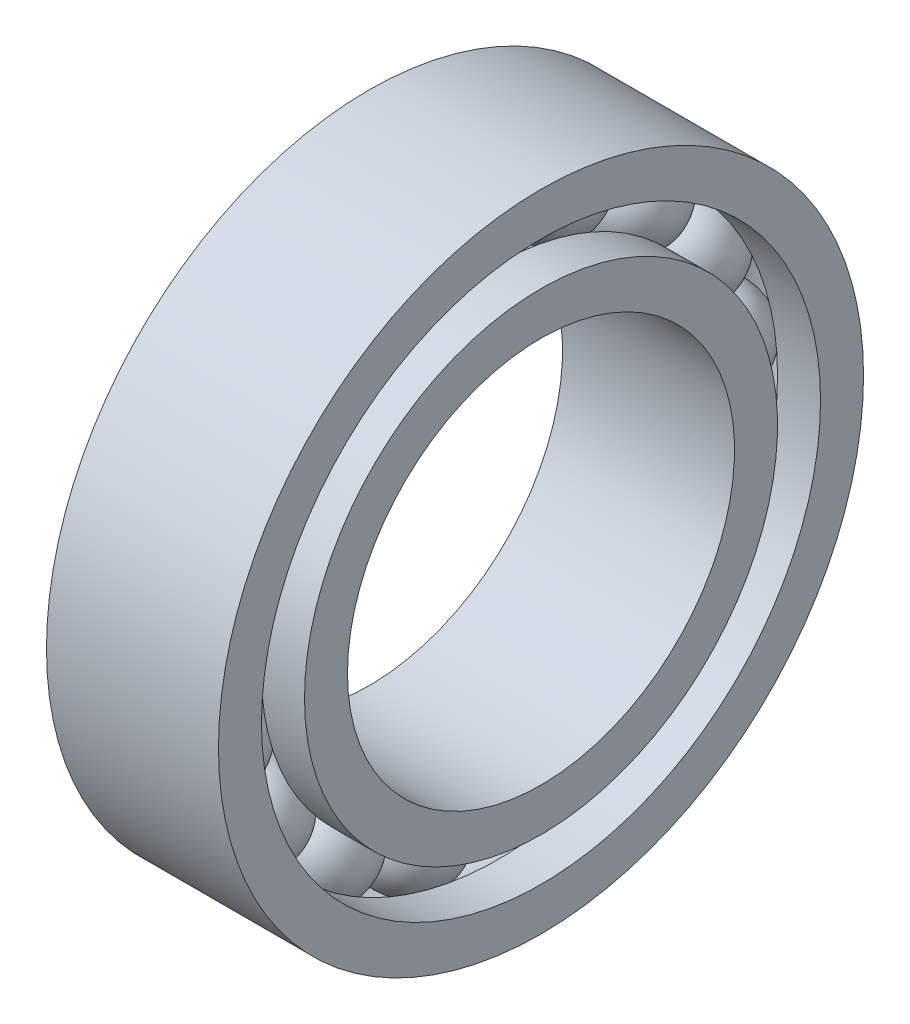
ISO-10303-21;
HEADER;
FILE_DESCRIPTION(('STEP AP214'),'2;1');
FILE_NAME('part.step','',(''),(''),'','','');
FILE_SCHEMA(('AUTOMOTIVE_DESIGN { 1 0 10303 214 1 1 1 1 }'));
ENDSEC;
DATA;
#1=APPLICATION_CONTEXT('core data for automotive mechanical design processes');
#2=APPLICATION_PROTOCOL_DEFINITION('international standard','automotive_design',2000,#1);
#3=PRODUCT_CONTEXT('',#1,'mechanical');
#4=PRODUCT('Part','Part','',(#3));
#5=PRODUCT_RELATED_PRODUCT_CATEGORY('part','',(#4));
#6=PRODUCT_DEFINITION_FORMATION('','',#4);
#7=PRODUCT_DEFINITION_CONTEXT('part definition',#1,'design');
#8=PRODUCT_DEFINITION('design','',#6,#7);
#9=PRODUCT_DEFINITION_SHAPE('','',#8);
#10=(LENGTH_UNIT() NAMED_UNIT(*) SI_UNIT(.MILLI.,.METRE.));
#11=(NAMED_UNIT(*) PLANE_ANGLE_UNIT() SI_UNIT($,.RADIAN.));
#12=(NAMED_UNIT(*) SI_UNIT($,.STERADIAN.) SOLID_ANGLE_UNIT());
#13=UNCERTAINTY_MEASURE_WITH_UNIT(LENGTH_MEASURE(1.E-05),#10,'distance_accuracy_value','');
#14=(GEOMETRIC_REPRESENTATION_CONTEXT(3) GLOBAL_UNCERTAINTY_ASSIGNED_CONTEXT((#13)) GLOBAL_UNIT_ASSIGNED_CONTEXT((#10,
#11,#12)) REPRESENTATION_CONTEXT('',''));
#15=CARTESIAN_POINT('',(0.,0.,0.));
#16=DIRECTION('',(0.,0.,1.));
#17=DIRECTION('',(1.,0.,0.));
#18=AXIS2_PLACEMENT_3D('',#15,#16,#17);
#19=CARTESIAN_POINT('',(0.,10.9483337642616,-21.6744999712284));
#20=DIRECTION('',(-1.,0.,0.));
#21=DIRECTION('',(0.,0.932472229404361,-0.361241666187141));
#22=AXIS2_PLACEMENT_3D('',#19,#20,#21);
#23=SPHERICAL_SURFACE('',#22,11.);
#24=CARTESIAN_POINT('',(-11.,10.9483337642616,-21.6744999712284));
#25=VERTEX_POINT('',#24);
#26=VERTEX_LOOP('',#25);
#27=FACE_BOUND('',#26,.T.);
#28=ADVANCED_FACE('F42',(#27),#23,.T.);
#29=CLOSED_SHELL('',(#28));
#30=MANIFOLD_SOLID_BREP('B2',#29);
#31=CARTESIAN_POINT('',(0.,-0.659464966759945,-40.4217386187929));
#32=DIRECTION('',(-1.,0.,0.));
#33=DIRECTION('',(0.,0.739008917220668,-0.673695643646548));
#34=AXIS2_PLACEMENT_3D('',#31,#32,#33);
#35=SPHERICAL_SURFACE('',#34,11.);
#36=CARTESIAN_POINT('',(-11.,-0.659464966759945,-40.4217386187929));
#37=VERTEX_POINT('',#36);
#38=VERTEX_LOOP('',#37);
#39=FACE_BOUND('',#38,.T.);
#40=ADVANCED_FACE('F63',(#39),#35,.T.);
#41=CLOSED_SHELL('',(#40));
#42=MANIFOLD_SOLID_BREP('B6',#41);
#43=CARTESIAN_POINT('',(0.,-18.2556986534071,-53.7097974813034));
#44=DIRECTION('',(-1.,0.,0.));
#45=DIRECTION('',(0.,0.445738355776549,-0.895163291355057));
#46=AXIS2_PLACEMENT_3D('',#43,#44,#45);
#47=SPHERICAL_SURFACE('',#46,11.);
#48=CARTESIAN_POINT('',(-11.,-18.2556986534071,-53.7097974813034));
#49=VERTEX_POINT('',#48);
#50=VERTEX_LOOP('',#49);
#51=FACE_BOUND('',#50,.T.);
#52=ADVANCED_FACE('F84',(#51),#47,.T.);
#53=CLOSED_SHELL('',(#52));
#54=MANIFOLD_SOLID_BREP('B38',#53);
#55=CARTESIAN_POINT('',(0.,-39.4638984322012,-59.744050577702));
#56=DIRECTION('',(-1.,0.,0.));
#57=DIRECTION('',(0.,0.092268359463313,-0.995734176295033));
#58=AXIS2_PLACEMENT_3D('',#55,#56,#57);
#59=SPHERICAL_SURFACE('',#58,11.);
#60=CARTESIAN_POINT('',(-11.,-39.4638984322012,-59.744050577702));
#61=VERTEX_POINT('',#60);
#62=VERTEX_LOOP('',#61);
#63=FACE_BOUND('',#62,.T.);
#64=ADVANCED_FACE('F105',(#63),#59,.T.);
#65=CLOSED_SHELL('',(#64));
#66=MANIFOLD_SOLID_BREP('B59',#65);
#67=CARTESIAN_POINT('',(0.,-61.4197794043244,-57.7095385903693));
#68=DIRECTION('',(-1.,0.,0.));
#69=DIRECTION('',(0.,-0.273662990072073,-0.961825643172822));
#70=AXIS2_PLACEMENT_3D('',#67,#68,#69);
#71=SPHERICAL_SURFACE('',#70,11.);
#72=CARTESIAN_POINT('',(-11.,-61.4197794043244,-57.7095385903693));
#73=VERTEX_POINT('',#72);
#74=VERTEX_LOOP('',#73);
#75=FACE_BOUND('',#74,.T.);
#76=ADVANCED_FACE('F126',(#75),#71,.T.);
#77=CLOSED_SHELL('',(#76));
#78=MANIFOLD_SOLID_BREP('B80',#77);
#79=CARTESIAN_POINT('',(0.,-81.158078182755,-47.8810336368147));
#80=DIRECTION('',(-1.,0.,0.));
#81=DIRECTION('',(0.,-0.602634636379249,-0.798017227280245));
#82=AXIS2_PLACEMENT_3D('',#79,#80,#81);
#83=SPHERICAL_SURFACE('',#82,11.);
#84=CARTESIAN_POINT('',(-11.,-81.158078182755,-47.8810336368147));
#85=VERTEX_POINT('',#84);
#86=VERTEX_LOOP('',#85);
#87=FACE_BOUND('',#86,.T.);
#88=ADVANCED_FACE('F147',(#87),#83,.T.);
#89=CLOSED_SHELL('',(#88));
#90=MANIFOLD_SOLID_BREP('B101',#89);
#91=CARTESIAN_POINT('',(0.,-96.0130281437766,-31.5859297726418));
#92=DIRECTION('',(-1.,0.,0.));
#93=DIRECTION('',(0.,-0.85021713572961,-0.526432162877363));
#94=AXIS2_PLACEMENT_3D('',#91,#92,#93);
#95=SPHERICAL_SURFACE('',#94,11.);
#96=CARTESIAN_POINT('',(-11.,-96.0130281437766,-31.5859297726418));
#97=VERTEX_POINT('',#96);
#98=VERTEX_LOOP('',#97);
#99=FACE_BOUND('',#98,.T.);
#100=ADVANCED_FACE('F168',(#99),#95,.T.);
#101=CLOSED_SHELL('',(#100));
#102=MANIFOLD_SOLID_BREP('B122',#101);
#103=CARTESIAN_POINT('',(0.,-103.978385981034,-11.0249710689947));
#104=DIRECTION('',(-1.,0.,0.));
#105=DIRECTION('',(0.,-0.9829730996839,-0.183749517816578));
#106=AXIS2_PLACEMENT_3D('',#103,#104,#105);
#107=SPHERICAL_SURFACE('',#106,11.);
#108=CARTESIAN_POINT('',(-11.,-103.978385981034,-11.0249710689947));
#109=VERTEX_POINT('',#108);
#110=VERTEX_LOOP('',#109);
#111=FACE_BOUND('',#110,.T.);
#112=ADVANCED_FACE('F189',(#111),#107,.T.);
#113=CLOSED_SHELL('',(#112));
#114=MANIFOLD_SOLID_BREP('B143',#113);
#115=CARTESIAN_POINT('',(0.,-103.978385981034,11.0249710689938));
#116=DIRECTION('',(-1.,0.,0.));
#117=DIRECTION('',(0.,-0.982973099683903,0.183749517816564));
#118=AXIS2_PLACEMENT_3D('',#115,#116,#117);
#119=SPHERICAL_SURFACE('',#118,11.);
#120=CARTESIAN_POINT('',(-11.,-103.978385981034,11.0249710689938));
#121=VERTEX_POINT('',#120);
#122=VERTEX_LOOP('',#121);
#123=FACE_BOUND('',#122,.T.);
#124=ADVANCED_FACE('F210',(#123),#119,.T.);
#125=CLOSED_SHELL('',(#124));
#126=MANIFOLD_SOLID_BREP('B164',#125);
#127=CARTESIAN_POINT('',(0.,-96.013028143777,31.585929772641));
#128=DIRECTION('',(-1.,0.,0.));
#129=DIRECTION('',(0.,-0.850217135729617,0.526432162877351));
#130=AXIS2_PLACEMENT_3D('',#127,#128,#129);
#131=SPHERICAL_SURFACE('',#130,11.);
#132=CARTESIAN_POINT('',(-11.,-96.013028143777,31.585929772641));
#133=VERTEX_POINT('',#132);
#134=VERTEX_LOOP('',#133);
#135=FACE_BOUND('',#134,.T.);
#136=ADVANCED_FACE('F231',(#135),#131,.T.);
#137=CLOSED_SHELL('',(#136));
#138=MANIFOLD_SOLID_BREP('B185',#137);
#139=CARTESIAN_POINT('',(0.,-81.1580781827556,47.8810336368142));
#140=DIRECTION('',(-1.,0.,0.));
#141=DIRECTION('',(0.,-0.602634636379261,0.798017227280236));
#142=AXIS2_PLACEMENT_3D('',#139,#140,#141);
#143=SPHERICAL_SURFACE('',#142,11.);
#144=CARTESIAN_POINT('',(-11.,-81.1580781827556,47.8810336368142));
#145=VERTEX_POINT('',#144);
#146=VERTEX_LOOP('',#145);
#147=FACE_BOUND('',#146,.T.);
#148=ADVANCED_FACE('F252',(#147),#143,.T.);
#149=CLOSED_SHELL('',(#148));
#150=MANIFOLD_SOLID_BREP('B206',#149);
#151=CARTESIAN_POINT('',(0.,-61.4197794043252,57.7095385903691));
#152=DIRECTION('',(-1.,0.,0.));
#153=DIRECTION('',(0.,-0.273662990072087,0.961825643172818));
#154=AXIS2_PLACEMENT_3D('',#151,#152,#153);
#155=SPHERICAL_SURFACE('',#154,11.);
#156=CARTESIAN_POINT('',(-11.,-61.4197794043252,57.7095385903691));
#157=VERTEX_POINT('',#156);
#158=VERTEX_LOOP('',#157);
#159=FACE_BOUND('',#158,.T.);
#160=ADVANCED_FACE('F273',(#159),#155,.T.);
#161=CLOSED_SHELL('',(#160));
#162=MANIFOLD_SOLID_BREP('B227',#161);
#163=CARTESIAN_POINT('',(0.,-39.4638984322021,59.7440505777021));
#164=DIRECTION('',(-1.,0.,0.));
#165=DIRECTION('',(0.,0.0922683594632987,0.995734176295035));
#166=AXIS2_PLACEMENT_3D('',#163,#164,#165);
#167=SPHERICAL_SURFACE('',#166,11.);
#168=CARTESIAN_POINT('',(-11.,-39.4638984322021,59.7440505777021));
#169=VERTEX_POINT('',#168);
#170=VERTEX_LOOP('',#169);
#171=FACE_BOUND('',#170,.T.);
#172=ADVANCED_FACE('F294',(#171),#167,.T.);
#173=CLOSED_SHELL('',(#172));
#174=MANIFOLD_SOLID_BREP('B248',#173);
#175=CARTESIAN_POINT('',(0.,-18.2556986534078,53.7097974813038));
#176=DIRECTION('',(-1.,0.,0.));
#177=DIRECTION('',(0.,0.445738355776536,0.895163291355063));
#178=AXIS2_PLACEMENT_3D('',#175,#176,#177);
#179=SPHERICAL_SURFACE('',#178,11.);
#180=CARTESIAN_POINT('',(-11.,-18.2556986534078,53.7097974813038));
#181=VERTEX_POINT('',#180);
#182=VERTEX_LOOP('',#181);
#183=FACE_BOUND('',#182,.T.);
#184=ADVANCED_FACE('F315',(#183),#179,.T.);
#185=CLOSED_SHELL('',(#184));
#186=MANIFOLD_SOLID_BREP('B269',#185);
#187=CARTESIAN_POINT('',(0.,-0.659464966760519,40.4217386187935));
#188=DIRECTION('',(-1.,0.,0.));
#189=DIRECTION('',(0.,0.739008917220658,0.673695643646558));
#190=AXIS2_PLACEMENT_3D('',#187,#188,#189);
#191=SPHERICAL_SURFACE('',#190,11.);
#192=CARTESIAN_POINT('',(-11.,-0.659464966760519,40.4217386187935));
#193=VERTEX_POINT('',#192);
#194=VERTEX_LOOP('',#193);
#195=FACE_BOUND('',#194,.T.);
#196=ADVANCED_FACE('F336',(#195),#191,.T.);
#197=CLOSED_SHELL('',(#196));
#198=MANIFOLD_SOLID_BREP('B290',#197);
#199=CARTESIAN_POINT('',(0.,10.9483337642613,21.6744999712292));
#200=DIRECTION('',(-1.,0.,0.));
#201=DIRECTION('',(0.,0.932472229404355,0.361241666187154));
#202=AXIS2_PLACEMENT_3D('',#199,#200,#201);
#203=SPHERICAL_SURFACE('',#202,11.);
#204=CARTESIAN_POINT('',(-11.,10.9483337642613,21.6744999712292));
#205=VERTEX_POINT('',#204);
#206=VERTEX_LOOP('',#205);
#207=FACE_BOUND('',#206,.T.);
#208=ADVANCED_FACE('F357',(#207),#203,.T.);
#209=CLOSED_SHELL('',(#208));
#210=MANIFOLD_SOLID_BREP('B311',#209);
#211=CARTESIAN_POINT('',(0.,15.,0.));
#212=DIRECTION('',(-1.,0.,0.));
#213=DIRECTION('',(0.,1.,0.));
#214=AXIS2_PLACEMENT_3D('',#211,#212,#213);
#215=SPHERICAL_SURFACE('',#214,11.);
#216=CARTESIAN_POINT('',(-11.,15.,0.));
#217=VERTEX_POINT('',#216);
#218=VERTEX_LOOP('',#217);
#219=FACE_BOUND('',#218,.T.);
#220=ADVANCED_FACE('F380',(#219),#215,.T.);
#221=CLOSED_SHELL('',(#220));
#222=MANIFOLD_SOLID_BREP('B332',#221);
#223=CARTESIAN_POINT('',(-20.,0.,0.));
#224=DIRECTION('',(1.,0.,0.));
#225=DIRECTION('',(0.,0.,-1.));
#226=AXIS2_PLACEMENT_3D('',#223,#224,#225);
#227=PLANE('',#226);
#228=CARTESIAN_POINT('',(-20.,-45.,0.));
#229=DIRECTION('',(-1.,0.,0.));
#230=DIRECTION('',(0.,0.,1.));
#231=AXIS2_PLACEMENT_3D('',#228,#229,#230);
#232=CIRCLE('',#231,45.);
#233=CARTESIAN_POINT('',(-20.,-45.,45.));
#234=VERTEX_POINT('',#233);
#235=EDGE_CURVE('E379',#234,#234,#232,.T.);
#236=ORIENTED_EDGE('',*,*,#235,.F.);
#237=EDGE_LOOP('',(#236));
#238=FACE_BOUND('',#237,.T.);
#239=CARTESIAN_POINT('',(-20.,-45.,0.));
#240=DIRECTION('',(-1.,0.,0.));
#241=DIRECTION('',(0.,0.,1.));
#242=AXIS2_PLACEMENT_3D('',#239,#240,#241);
#243=CIRCLE('',#242,55.);
#244=CARTESIAN_POINT('',(-20.,-45.,55.));
#245=VERTEX_POINT('',#244);
#246=EDGE_CURVE('E424',#245,#245,#243,.T.);
#247=ORIENTED_EDGE('',*,*,#246,.T.);
#248=EDGE_LOOP('',(#247));
#249=FACE_BOUND('',#248,.T.);
#250=ADVANCED_FACE('F402',(#238,#249),#227,.F.);
#251=CARTESIAN_POINT('',(0.,-45.,0.));
#252=DIRECTION('',(-1.,0.,0.));
#253=DIRECTION('',(0.,0.,1.));
#254=AXIS2_PLACEMENT_3D('',#251,#252,#253);
#255=CYLINDRICAL_SURFACE('',#254,45.);
#256=CARTESIAN_POINT('',(20.,-45.,0.));
#257=DIRECTION('',(-1.,0.,0.));
#258=DIRECTION('',(0.,0.,1.));
#259=AXIS2_PLACEMENT_3D('',#256,#257,#258);
#260=CIRCLE('',#259,45.);
#261=CARTESIAN_POINT('',(20.,-45.,45.));
#262=VERTEX_POINT('',#261);
#263=EDGE_CURVE('E408',#262,#262,#260,.T.);
#264=ORIENTED_EDGE('',*,*,#263,.F.);
#265=EDGE_LOOP('',(#264));
#266=FACE_BOUND('',#265,.T.);
#267=ORIENTED_EDGE('',*,*,#235,.T.);
#268=EDGE_LOOP('',(#267));
#269=FACE_BOUND('',#268,.T.);
#270=ADVANCED_FACE('F449',(#266,#269),#255,.F.);
#271=CARTESIAN_POINT('',(20.,0.,0.));
#272=DIRECTION('',(-1.,0.,0.));
#273=DIRECTION('',(0.,0.,1.));
#274=AXIS2_PLACEMENT_3D('',#271,#272,#273);
#275=PLANE('',#274);
#276=CARTESIAN_POINT('',(20.,-45.,0.));
#277=DIRECTION('',(-1.,0.,0.));
#278=DIRECTION('',(0.,0.,1.));
#279=AXIS2_PLACEMENT_3D('',#276,#277,#278);
#280=CIRCLE('',#279,55.);
#281=CARTESIAN_POINT('',(20.,-45.,55.));
#282=VERTEX_POINT('',#281);
#283=EDGE_CURVE('E412',#282,#282,#280,.T.);
#284=ORIENTED_EDGE('',*,*,#283,.F.);
#285=EDGE_LOOP('',(#284));
#286=FACE_BOUND('',#285,.T.);
#287=ORIENTED_EDGE('',*,*,#263,.T.);
#288=EDGE_LOOP('',(#287));
#289=FACE_BOUND('',#288,.T.);
#290=ADVANCED_FACE('F444',(#286,#289),#275,.F.);
#291=CARTESIAN_POINT('',(0.,-45.,0.));
#292=DIRECTION('',(-1.,0.,0.));
#293=DIRECTION('',(0.,0.,1.));
#294=AXIS2_PLACEMENT_3D('',#291,#292,#293);
#295=CYLINDRICAL_SURFACE('',#294,55.);
#296=CARTESIAN_POINT('',(10.,-45.,0.));
#297=DIRECTION('',(-1.,0.,0.));
#298=DIRECTION('',(0.,0.,1.));
#299=AXIS2_PLACEMENT_3D('',#296,#297,#298);
#300=CIRCLE('',#299,55.);
#301=CARTESIAN_POINT('',(10.,-45.,55.));
#302=VERTEX_POINT('',#301);
#303=EDGE_CURVE('E416',#302,#302,#300,.T.);
#304=ORIENTED_EDGE('',*,*,#303,.F.);
#305=EDGE_LOOP('',(#304));
#306=FACE_BOUND('',#305,.T.);
#307=ORIENTED_EDGE('',*,*,#283,.T.);
#308=EDGE_LOOP('',(#307));
#309=FACE_BOUND('',#308,.T.);
#310=ADVANCED_FACE('F438',(#306,#309),#295,.T.);
#311=CARTESIAN_POINT('',(0.,-45.,0.));
#312=DIRECTION('',(-1.,0.,0.));
#313=DIRECTION('',(0.,0.,1.));
#314=AXIS2_PLACEMENT_3D('',#311,#312,#313);
#315=TOROIDAL_SURFACE('',#314,60.,11.180339887499);
#316=CARTESIAN_POINT('',(-10.,-45.,0.));
#317=DIRECTION('',(-1.,0.,0.));
#318=DIRECTION('',(0.,0.,1.));
#319=AXIS2_PLACEMENT_3D('',#316,#317,#318);
#320=CIRCLE('',#319,55.);
#321=CARTESIAN_POINT('',(-10.,-45.,55.));
#322=VERTEX_POINT('',#321);
#323=EDGE_CURVE('E421',#322,#322,#320,.T.);
#324=ORIENTED_EDGE('',*,*,#323,.F.);
#325=EDGE_LOOP('',(#324));
#326=FACE_BOUND('',#325,.T.);
#327=ORIENTED_EDGE('',*,*,#303,.T.);
#328=EDGE_LOOP('',(#327));
#329=FACE_BOUND('',#328,.T.);
#330=ADVANCED_FACE('F432',(#326,#329),#315,.F.);
#331=CARTESIAN_POINT('',(0.,-45.,0.));
#332=DIRECTION('',(-1.,0.,0.));
#333=DIRECTION('',(0.,0.,1.));
#334=AXIS2_PLACEMENT_3D('',#331,#332,#333);
#335=CYLINDRICAL_SURFACE('',#334,55.);
#336=ORIENTED_EDGE('',*,*,#246,.F.);
#337=EDGE_LOOP('',(#336));
#338=FACE_BOUND('',#337,.T.);
#339=ORIENTED_EDGE('',*,*,#323,.T.);
#340=EDGE_LOOP('',(#339));
#341=FACE_BOUND('',#340,.T.);
#342=ADVANCED_FACE('F429',(#338,#341),#335,.T.);
#343=CLOSED_SHELL('',(#250,#270,#290,#310,#330,#342));
#344=MANIFOLD_SOLID_BREP('B353',#343);
#345=CARTESIAN_POINT('',(0.,-45.,0.));
#346=DIRECTION('',(-1.,0.,0.));
#347=DIRECTION('',(0.,0.,1.));
#348=AXIS2_PLACEMENT_3D('',#345,#346,#347);
#349=TOROIDAL_SURFACE('',#348,60.,11.180339887499);
#350=CARTESIAN_POINT('',(10.,-45.,0.));
#351=DIRECTION('',(-1.,0.,0.));
#352=DIRECTION('',(0.,0.,1.));
#353=AXIS2_PLACEMENT_3D('',#350,#351,#352);
#354=CIRCLE('',#353,65.);
#355=CARTESIAN_POINT('',(10.,-45.,65.));
#356=VERTEX_POINT('',#355);
#357=EDGE_CURVE('E528',#356,#356,#354,.T.);
#358=ORIENTED_EDGE('',*,*,#357,.F.);
#359=EDGE_LOOP('',(#358));
#360=FACE_BOUND('',#359,.T.);
#361=CARTESIAN_POINT('',(-10.,-45.,0.));
#362=DIRECTION('',(-1.,0.,0.));
#363=DIRECTION('',(0.,0.,1.));
#364=AXIS2_PLACEMENT_3D('',#361,#362,#363);
#365=CIRCLE('',#364,65.);
#366=CARTESIAN_POINT('',(-10.,-45.,65.));
#367=VERTEX_POINT('',#366);
#368=EDGE_CURVE('E401',#367,#367,#365,.T.);
#369=ORIENTED_EDGE('',*,*,#368,.T.);
#370=EDGE_LOOP('',(#369));
#371=FACE_BOUND('',#370,.T.);
#372=ADVANCED_FACE('F506',(#360,#371),#349,.F.);
#373=CARTESIAN_POINT('',(0.,-45.,0.));
#374=DIRECTION('',(-1.,0.,0.));
#375=DIRECTION('',(0.,0.,1.));
#376=AXIS2_PLACEMENT_3D('',#373,#374,#375);
#377=CYLINDRICAL_SURFACE('',#376,65.);
#378=ORIENTED_EDGE('',*,*,#368,.F.);
#379=EDGE_LOOP('',(#378));
#380=FACE_BOUND('',#379,.T.);
#381=CARTESIAN_POINT('',(-20.,-45.,0.));
#382=DIRECTION('',(-1.,0.,0.));
#383=DIRECTION('',(0.,0.,1.));
#384=AXIS2_PLACEMENT_3D('',#381,#382,#383);
#385=CIRCLE('',#384,65.);
#386=CARTESIAN_POINT('',(-20.,-45.,65.));
#387=VERTEX_POINT('',#386);
#388=EDGE_CURVE('E512',#387,#387,#385,.T.);
#389=ORIENTED_EDGE('',*,*,#388,.T.);
#390=EDGE_LOOP('',(#389));
#391=FACE_BOUND('',#390,.T.);
#392=ADVANCED_FACE('F535',(#380,#391),#377,.F.);
#393=CARTESIAN_POINT('',(-20.,30.,0.));
#394=DIRECTION('',(1.,0.,0.));
#395=DIRECTION('',(0.,0.,-1.));
#396=AXIS2_PLACEMENT_3D('',#393,#394,#395);
#397=PLANE('',#396);
#398=ORIENTED_EDGE('',*,*,#388,.F.);
#399=EDGE_LOOP('',(#398));
#400=FACE_BOUND('',#399,.T.);
#401=CARTESIAN_POINT('',(-20.,-45.,0.));
#402=DIRECTION('',(-1.,0.,0.));
#403=DIRECTION('',(0.,0.,1.));
#404=AXIS2_PLACEMENT_3D('',#401,#402,#403);
#405=CIRCLE('',#404,75.);
#406=CARTESIAN_POINT('',(-20.,-45.,75.));
#407=VERTEX_POINT('',#406);
#408=EDGE_CURVE('E516',#407,#407,#405,.T.);
#409=ORIENTED_EDGE('',*,*,#408,.T.);
#410=EDGE_LOOP('',(#409));
#411=FACE_BOUND('',#410,.T.);
#412=ADVANCED_FACE('F539',(#400,#411),#397,.F.);
#413=CARTESIAN_POINT('',(0.,-45.,0.));
#414=DIRECTION('',(-1.,0.,0.));
#415=DIRECTION('',(0.,0.,1.));
#416=AXIS2_PLACEMENT_3D('',#413,#414,#415);
#417=CYLINDRICAL_SURFACE('',#416,75.);
#418=ORIENTED_EDGE('',*,*,#408,.F.);
#419=EDGE_LOOP('',(#418));
#420=FACE_BOUND('',#419,.T.);
#421=CARTESIAN_POINT('',(20.,-45.,0.));
#422=DIRECTION('',(-1.,0.,0.));
#423=DIRECTION('',(0.,0.,1.));
#424=AXIS2_PLACEMENT_3D('',#421,#422,#423);
#425=CIRCLE('',#424,75.);
#426=CARTESIAN_POINT('',(20.,-45.,75.));
#427=VERTEX_POINT('',#426);
#428=EDGE_CURVE('E520',#427,#427,#425,.T.);
#429=ORIENTED_EDGE('',*,*,#428,.T.);
#430=EDGE_LOOP('',(#429));
#431=FACE_BOUND('',#430,.T.);
#432=ADVANCED_FACE('F544',(#420,#431),#417,.T.);
#433=CARTESIAN_POINT('',(20.,30.,0.));
#434=DIRECTION('',(-1.,0.,0.));
#435=DIRECTION('',(0.,0.,1.));
#436=AXIS2_PLACEMENT_3D('',#433,#434,#435);
#437=PLANE('',#436);
#438=ORIENTED_EDGE('',*,*,#428,.F.);
#439=EDGE_LOOP('',(#438));
#440=FACE_BOUND('',#439,.T.);
#441=CARTESIAN_POINT('',(20.,-45.,0.));
#442=DIRECTION('',(-1.,0.,0.));
#443=DIRECTION('',(0.,0.,1.));
#444=AXIS2_PLACEMENT_3D('',#441,#442,#443);
#445=CIRCLE('',#444,65.);
#446=CARTESIAN_POINT('',(20.,-45.,65.));
#447=VERTEX_POINT('',#446);
#448=EDGE_CURVE('E525',#447,#447,#445,.T.);
#449=ORIENTED_EDGE('',*,*,#448,.T.);
#450=EDGE_LOOP('',(#449));
#451=FACE_BOUND('',#450,.T.);
#452=ADVANCED_FACE('F550',(#440,#451),#437,.F.);
#453=CARTESIAN_POINT('',(0.,-45.,0.));
#454=DIRECTION('',(-1.,0.,0.));
#455=DIRECTION('',(0.,0.,1.));
#456=AXIS2_PLACEMENT_3D('',#453,#454,#455);
#457=CYLINDRICAL_SURFACE('',#456,65.);
#458=ORIENTED_EDGE('',*,*,#448,.F.);
#459=EDGE_LOOP('',(#458));
#460=FACE_BOUND('',#459,.T.);
#461=ORIENTED_EDGE('',*,*,#357,.T.);
#462=EDGE_LOOP('',(#461));
#463=FACE_BOUND('',#462,.T.);
#464=ADVANCED_FACE('F532',(#460,#463),#457,.F.);
#465=CLOSED_SHELL('',(#372,#392,#412,#432,#452,#464));
#466=MANIFOLD_SOLID_BREP('B374',#465);
#467=ADVANCED_BREP_SHAPE_REPRESENTATION('',(#18,#30,#42,#54,#66,#78,#90,#102,#114,#126,#138,
#150,#162,#174,#186,#198,#210,#222,#344,#466),#14);
#468=SHAPE_DEFINITION_REPRESENTATION(#9,#467);
ENDSEC;
END-ISO-10303-21;
